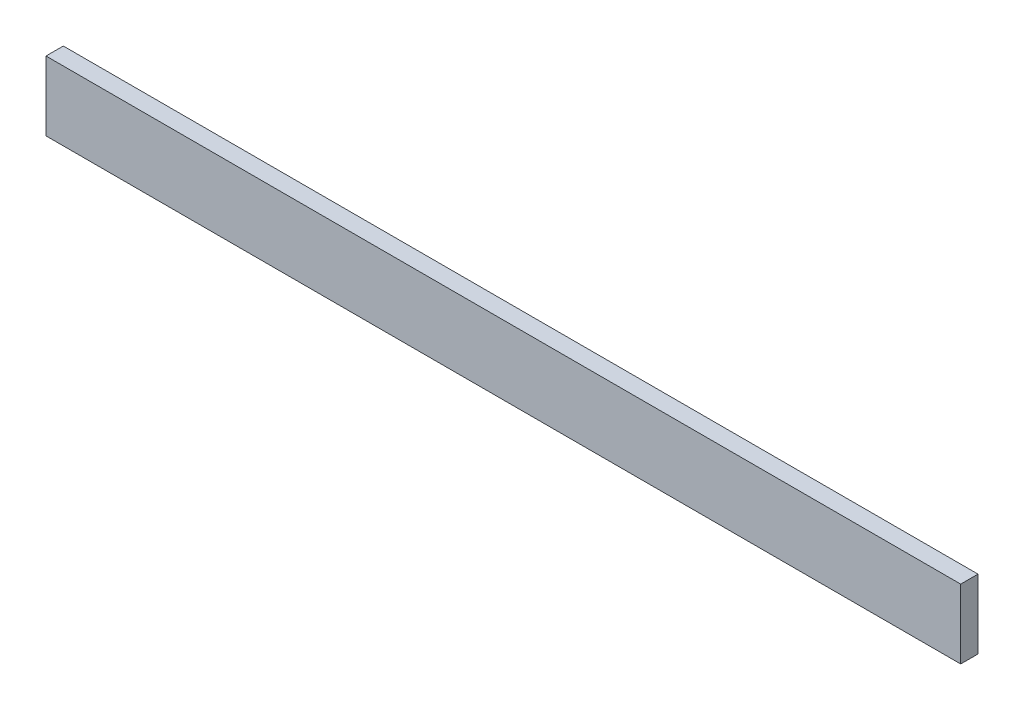
ISO-10303-21;
HEADER;
FILE_DESCRIPTION(('STEP AP214'),'2;1');
FILE_NAME('part.step','',(''),(''),'','','');
FILE_SCHEMA(('AUTOMOTIVE_DESIGN { 1 0 10303 214 1 1 1 1 }'));
ENDSEC;
DATA;
#1=APPLICATION_CONTEXT('core data for automotive mechanical design processes');
#2=APPLICATION_PROTOCOL_DEFINITION('international standard','automotive_design',2000,#1);
#3=PRODUCT_CONTEXT('',#1,'mechanical');
#4=PRODUCT('Part','Part','',(#3));
#5=PRODUCT_RELATED_PRODUCT_CATEGORY('part','',(#4));
#6=PRODUCT_DEFINITION_FORMATION('','',#4);
#7=PRODUCT_DEFINITION_CONTEXT('part definition',#1,'design');
#8=PRODUCT_DEFINITION('design','',#6,#7);
#9=PRODUCT_DEFINITION_SHAPE('','',#8);
#10=(LENGTH_UNIT() NAMED_UNIT(*) SI_UNIT(.MILLI.,.METRE.));
#11=(NAMED_UNIT(*) PLANE_ANGLE_UNIT() SI_UNIT($,.RADIAN.));
#12=(NAMED_UNIT(*) SI_UNIT($,.STERADIAN.) SOLID_ANGLE_UNIT());
#13=UNCERTAINTY_MEASURE_WITH_UNIT(LENGTH_MEASURE(1.E-05),#10,'distance_accuracy_value','');
#14=(GEOMETRIC_REPRESENTATION_CONTEXT(3) GLOBAL_UNCERTAINTY_ASSIGNED_CONTEXT((#13)) GLOBAL_UNIT_ASSIGNED_CONTEXT((#10,
#11,#12)) REPRESENTATION_CONTEXT('',''));
#15=CARTESIAN_POINT('',(0.,0.,0.));
#16=DIRECTION('',(0.,0.,1.));
#17=DIRECTION('',(1.,0.,0.));
#18=AXIS2_PLACEMENT_3D('',#15,#16,#17);
#19=CARTESIAN_POINT('',(-335.75625,25.3999999999999,12.7));
#20=DIRECTION('',(1.,0.,0.));
#21=DIRECTION('',(0.,0.,-1.));
#22=AXIS2_PLACEMENT_3D('',#19,#20,#21);
#23=PLANE('',#22);
#24=DIRECTION('',(0.,-1.,0.));
#25=VECTOR('',#24,1.);
#26=CARTESIAN_POINT('',(-335.75625,25.3999999999999,0.));
#27=LINE('',#26,#25);
#28=CARTESIAN_POINT('',(-335.75625,25.3999999999999,0.));
#29=VERTEX_POINT('',#28);
#30=CARTESIAN_POINT('',(-335.75625,-25.4000000000001,0.));
#31=VERTEX_POINT('',#30);
#32=EDGE_CURVE('E95',#29,#31,#27,.T.);
#33=ORIENTED_EDGE('',*,*,#32,.T.);
#34=DIRECTION('',(0.,0.,-1.));
#35=VECTOR('',#34,1.);
#36=CARTESIAN_POINT('',(-335.75625,-25.4000000000001,12.7));
#37=LINE('',#36,#35);
#38=CARTESIAN_POINT('',(-335.75625,-25.4000000000001,12.7));
#39=VERTEX_POINT('',#38);
#40=EDGE_CURVE('E11',#39,#31,#37,.T.);
#41=ORIENTED_EDGE('',*,*,#40,.F.);
#42=DIRECTION('',(0.,-1.,0.));
#43=VECTOR('',#42,1.);
#44=CARTESIAN_POINT('',(-335.75625,25.3999999999999,12.7));
#45=LINE('',#44,#43);
#46=CARTESIAN_POINT('',(-335.75625,25.3999999999999,12.7));
#47=VERTEX_POINT('',#46);
#48=EDGE_CURVE('E83',#47,#39,#45,.T.);
#49=ORIENTED_EDGE('',*,*,#48,.F.);
#50=DIRECTION('',(0.,0.,-1.));
#51=VECTOR('',#50,1.);
#52=CARTESIAN_POINT('',(-335.75625,25.3999999999999,12.7));
#53=LINE('',#52,#51);
#54=EDGE_CURVE('E91',#47,#29,#53,.T.);
#55=ORIENTED_EDGE('',*,*,#54,.T.);
#56=EDGE_LOOP('',(#33,#41,#49,#55));
#57=FACE_BOUND('',#56,.T.);
#58=ADVANCED_FACE('F32',(#57),#23,.F.);
#59=CARTESIAN_POINT('',(335.75625,-25.4,12.7));
#60=DIRECTION('',(0.,1.,0.));
#61=DIRECTION('',(-1.,0.,0.));
#62=AXIS2_PLACEMENT_3D('',#59,#60,#61);
#63=PLANE('',#62);
#64=DIRECTION('',(1.,0.,0.));
#65=VECTOR('',#64,1.);
#66=CARTESIAN_POINT('',(335.75625,-25.4,0.));
#67=LINE('',#66,#65);
#68=CARTESIAN_POINT('',(335.75625,-25.4,0.));
#69=VERTEX_POINT('',#68);
#70=EDGE_CURVE('E87',#31,#69,#67,.T.);
#71=ORIENTED_EDGE('',*,*,#70,.T.);
#72=DIRECTION('',(0.,0.,-1.));
#73=VECTOR('',#72,1.);
#74=CARTESIAN_POINT('',(335.75625,-25.4,12.7));
#75=LINE('',#74,#73);
#76=CARTESIAN_POINT('',(335.75625,-25.4,12.7));
#77=VERTEX_POINT('',#76);
#78=EDGE_CURVE('E40',#77,#69,#75,.T.);
#79=ORIENTED_EDGE('',*,*,#78,.F.);
#80=DIRECTION('',(1.,0.,0.));
#81=VECTOR('',#80,1.);
#82=CARTESIAN_POINT('',(335.75625,-25.4,12.7));
#83=LINE('',#82,#81);
#84=EDGE_CURVE('E78',#39,#77,#83,.T.);
#85=ORIENTED_EDGE('',*,*,#84,.F.);
#86=ORIENTED_EDGE('',*,*,#40,.T.);
#87=EDGE_LOOP('',(#71,#79,#85,#86));
#88=FACE_BOUND('',#87,.T.);
#89=ADVANCED_FACE('F86',(#88),#63,.F.);
#90=CARTESIAN_POINT('',(335.75625,25.4,12.7));
#91=DIRECTION('',(-1.,0.,0.));
#92=DIRECTION('',(0.,0.,1.));
#93=AXIS2_PLACEMENT_3D('',#90,#91,#92);
#94=PLANE('',#93);
#95=DIRECTION('',(0.,1.,0.));
#96=VECTOR('',#95,1.);
#97=CARTESIAN_POINT('',(335.75625,25.4,0.));
#98=LINE('',#97,#96);
#99=CARTESIAN_POINT('',(335.75625,25.4,0.));
#100=VERTEX_POINT('',#99);
#101=EDGE_CURVE('E65',#69,#100,#98,.T.);
#102=ORIENTED_EDGE('',*,*,#101,.T.);
#103=DIRECTION('',(0.,0.,-1.));
#104=VECTOR('',#103,1.);
#105=CARTESIAN_POINT('',(335.75625,25.4,12.7));
#106=LINE('',#105,#104);
#107=CARTESIAN_POINT('',(335.75625,25.4,12.7));
#108=VERTEX_POINT('',#107);
#109=EDGE_CURVE('E88',#108,#100,#106,.T.);
#110=ORIENTED_EDGE('',*,*,#109,.F.);
#111=DIRECTION('',(0.,1.,0.));
#112=VECTOR('',#111,1.);
#113=CARTESIAN_POINT('',(335.75625,25.4,12.7));
#114=LINE('',#113,#112);
#115=EDGE_CURVE('E81',#77,#108,#114,.T.);
#116=ORIENTED_EDGE('',*,*,#115,.F.);
#117=ORIENTED_EDGE('',*,*,#78,.T.);
#118=EDGE_LOOP('',(#102,#110,#116,#117));
#119=FACE_BOUND('',#118,.T.);
#120=ADVANCED_FACE('F89',(#119),#94,.F.);
#121=CARTESIAN_POINT('',(335.75625,25.4,12.7));
#122=DIRECTION('',(0.,-1.,0.));
#123=DIRECTION('',(1.,0.,0.));
#124=AXIS2_PLACEMENT_3D('',#121,#122,#123);
#125=PLANE('',#124);
#126=DIRECTION('',(-1.,0.,0.));
#127=VECTOR('',#126,1.);
#128=CARTESIAN_POINT('',(335.75625,25.4,0.));
#129=LINE('',#128,#127);
#130=EDGE_CURVE('E71',#100,#29,#129,.T.);
#131=ORIENTED_EDGE('',*,*,#130,.T.);
#132=ORIENTED_EDGE('',*,*,#54,.F.);
#133=DIRECTION('',(-1.,0.,0.));
#134=VECTOR('',#133,1.);
#135=CARTESIAN_POINT('',(335.75625,25.4,12.7));
#136=LINE('',#135,#134);
#137=EDGE_CURVE('E48',#108,#47,#136,.T.);
#138=ORIENTED_EDGE('',*,*,#137,.F.);
#139=ORIENTED_EDGE('',*,*,#109,.T.);
#140=EDGE_LOOP('',(#131,#132,#138,#139));
#141=FACE_BOUND('',#140,.T.);
#142=ADVANCED_FACE('F102',(#141),#125,.F.);
#143=CARTESIAN_POINT('',(0.,0.,12.7));
#144=DIRECTION('',(0.,0.,-1.));
#145=DIRECTION('',(-1.,0.,0.));
#146=AXIS2_PLACEMENT_3D('',#143,#144,#145);
#147=PLANE('',#146);
#148=ORIENTED_EDGE('',*,*,#48,.T.);
#149=ORIENTED_EDGE('',*,*,#84,.T.);
#150=ORIENTED_EDGE('',*,*,#115,.T.);
#151=ORIENTED_EDGE('',*,*,#137,.T.);
#152=EDGE_LOOP('',(#148,#149,#150,#151));
#153=FACE_BOUND('',#152,.T.);
#154=ADVANCED_FACE('F79',(#153),#147,.F.);
#155=CARTESIAN_POINT('',(0.,0.,0.));
#156=DIRECTION('',(0.,0.,-1.));
#157=DIRECTION('',(-1.,0.,0.));
#158=AXIS2_PLACEMENT_3D('',#155,#156,#157);
#159=PLANE('',#158);
#160=ORIENTED_EDGE('',*,*,#32,.F.);
#161=ORIENTED_EDGE('',*,*,#130,.F.);
#162=ORIENTED_EDGE('',*,*,#101,.F.);
#163=ORIENTED_EDGE('',*,*,#70,.F.);
#164=EDGE_LOOP('',(#160,#161,#162,#163));
#165=FACE_BOUND('',#164,.T.);
#166=ADVANCED_FACE('F105',(#165),#159,.T.);
#167=CLOSED_SHELL('',(#58,#89,#120,#142,#154,#166));
#168=MANIFOLD_SOLID_BREP('B2',#167);
#169=ADVANCED_BREP_SHAPE_REPRESENTATION('',(#18,#168),#14);
#170=SHAPE_DEFINITION_REPRESENTATION(#9,#169);
ENDSEC;
END-ISO-10303-21;
